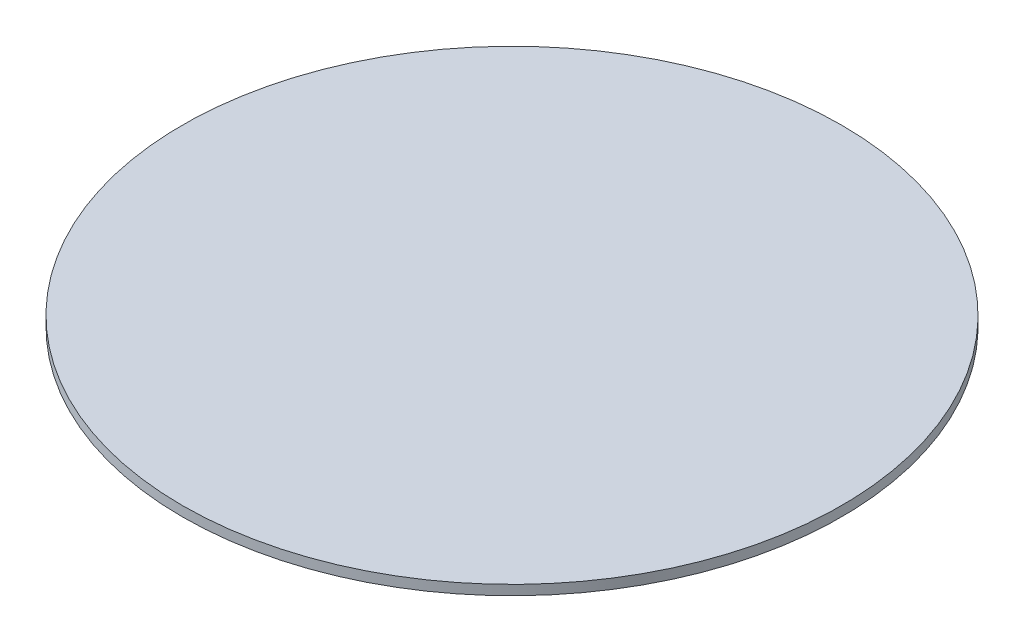
ISO-10303-21;
HEADER;
FILE_DESCRIPTION(('STEP AP214'),'2;1');
FILE_NAME('part.step','',(''),(''),'','','');
FILE_SCHEMA(('AUTOMOTIVE_DESIGN { 1 0 10303 214 1 1 1 1 }'));
ENDSEC;
DATA;
#1=APPLICATION_CONTEXT('core data for automotive mechanical design processes');
#2=APPLICATION_PROTOCOL_DEFINITION('international standard','automotive_design',2000,#1);
#3=PRODUCT_CONTEXT('',#1,'mechanical');
#4=PRODUCT('Part','Part','',(#3));
#5=PRODUCT_RELATED_PRODUCT_CATEGORY('part','',(#4));
#6=PRODUCT_DEFINITION_FORMATION('','',#4);
#7=PRODUCT_DEFINITION_CONTEXT('part definition',#1,'design');
#8=PRODUCT_DEFINITION('design','',#6,#7);
#9=PRODUCT_DEFINITION_SHAPE('','',#8);
#10=(LENGTH_UNIT() NAMED_UNIT(*) SI_UNIT(.MILLI.,.METRE.));
#11=(NAMED_UNIT(*) PLANE_ANGLE_UNIT() SI_UNIT($,.RADIAN.));
#12=(NAMED_UNIT(*) SI_UNIT($,.STERADIAN.) SOLID_ANGLE_UNIT());
#13=UNCERTAINTY_MEASURE_WITH_UNIT(LENGTH_MEASURE(1.E-05),#10,'distance_accuracy_value','');
#14=(GEOMETRIC_REPRESENTATION_CONTEXT(3) GLOBAL_UNCERTAINTY_ASSIGNED_CONTEXT((#13)) GLOBAL_UNIT_ASSIGNED_CONTEXT((#10,
#11,#12)) REPRESENTATION_CONTEXT('',''));
#15=CARTESIAN_POINT('',(0.,0.,0.));
#16=DIRECTION('',(0.,0.,1.));
#17=DIRECTION('',(1.,0.,0.));
#18=AXIS2_PLACEMENT_3D('',#15,#16,#17);
#19=CARTESIAN_POINT('',(0.,740.,-1425.));
#20=DIRECTION('',(0.,1.,0.));
#21=DIRECTION('',(0.,0.,1.));
#22=AXIS2_PLACEMENT_3D('',#19,#20,#21);
#23=CYLINDRICAL_SURFACE('',#22,335.);
#24=CARTESIAN_POINT('',(0.,740.,-1425.));
#25=DIRECTION('',(0.,1.,0.));
#26=DIRECTION('',(0.,0.,1.));
#27=AXIS2_PLACEMENT_3D('',#24,#25,#26);
#28=CIRCLE('',#27,335.);
#29=CARTESIAN_POINT('',(0.,740.,-1090.));
#30=VERTEX_POINT('',#29);
#31=EDGE_CURVE('E10',#30,#30,#28,.T.);
#32=ORIENTED_EDGE('',*,*,#31,.T.);
#33=EDGE_LOOP('',(#32));
#34=FACE_BOUND('',#33,.T.);
#35=CARTESIAN_POINT('',(0.,750.,-1425.));
#36=DIRECTION('',(0.,1.,0.));
#37=DIRECTION('',(0.,0.,1.));
#38=AXIS2_PLACEMENT_3D('',#35,#36,#37);
#39=CIRCLE('',#38,335.);
#40=CARTESIAN_POINT('',(0.,750.,-1090.));
#41=VERTEX_POINT('',#40);
#42=EDGE_CURVE('E21',#41,#41,#39,.T.);
#43=ORIENTED_EDGE('',*,*,#42,.F.);
#44=EDGE_LOOP('',(#43));
#45=FACE_BOUND('',#44,.T.);
#46=ADVANCED_FACE('F15',(#34,#45),#23,.T.);
#47=CARTESIAN_POINT('',(0.,740.,-1425.));
#48=DIRECTION('',(0.,1.,0.));
#49=DIRECTION('',(0.,0.,1.));
#50=AXIS2_PLACEMENT_3D('',#47,#48,#49);
#51=PLANE('',#50);
#52=ORIENTED_EDGE('',*,*,#31,.F.);
#53=EDGE_LOOP('',(#52));
#54=FACE_BOUND('',#53,.T.);
#55=ADVANCED_FACE('F30',(#54),#51,.F.);
#56=CARTESIAN_POINT('',(0.,750.,-1425.));
#57=DIRECTION('',(0.,1.,0.));
#58=DIRECTION('',(0.,0.,1.));
#59=AXIS2_PLACEMENT_3D('',#56,#57,#58);
#60=PLANE('',#59);
#61=ORIENTED_EDGE('',*,*,#42,.T.);
#62=EDGE_LOOP('',(#61));
#63=FACE_BOUND('',#62,.T.);
#64=ADVANCED_FACE('F27',(#63),#60,.T.);
#65=CLOSED_SHELL('',(#46,#55,#64));
#66=MANIFOLD_SOLID_BREP('B1',#65);
#67=ADVANCED_BREP_SHAPE_REPRESENTATION('',(#18,#66),#14);
#68=SHAPE_DEFINITION_REPRESENTATION(#9,#67);
ENDSEC;
END-ISO-10303-21;
